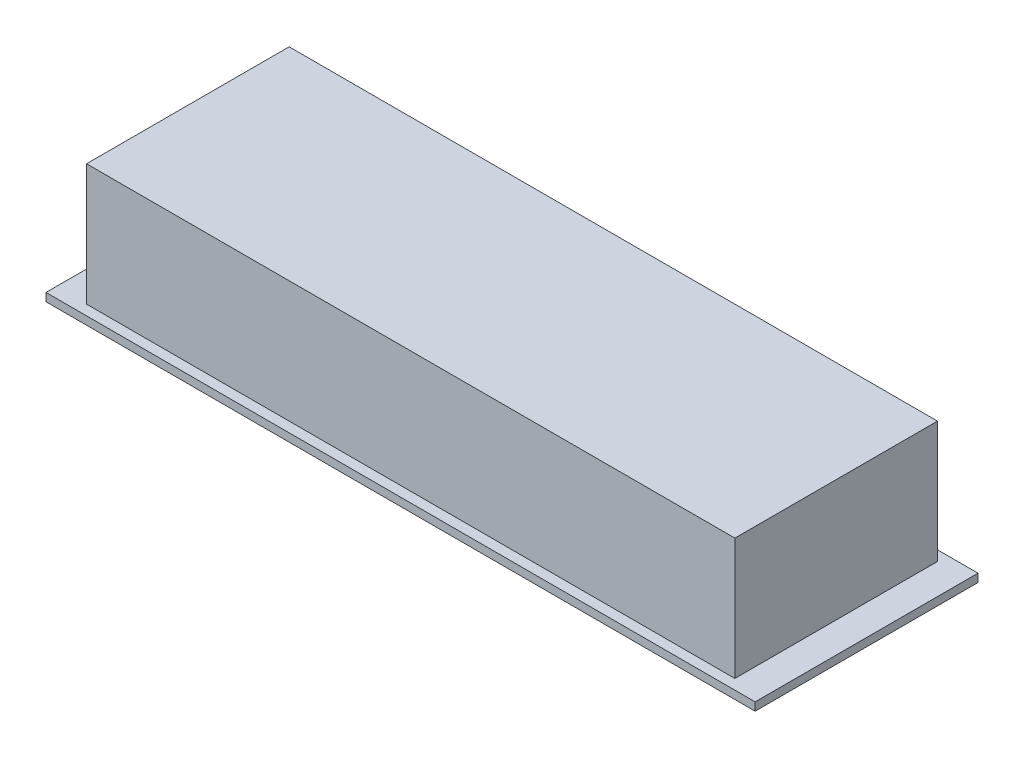
ISO-10303-21;
HEADER;
FILE_DESCRIPTION(('STEP AP214'),'2;1');
FILE_NAME('part.step','',(''),(''),'','','');
FILE_SCHEMA(('AUTOMOTIVE_DESIGN { 1 0 10303 214 1 1 1 1 }'));
ENDSEC;
DATA;
#1=APPLICATION_CONTEXT('core data for automotive mechanical design processes');
#2=APPLICATION_PROTOCOL_DEFINITION('international standard','automotive_design',2000,#1);
#3=PRODUCT_CONTEXT('',#1,'mechanical');
#4=PRODUCT('Part','Part','',(#3));
#5=PRODUCT_RELATED_PRODUCT_CATEGORY('part','',(#4));
#6=PRODUCT_DEFINITION_FORMATION('','',#4);
#7=PRODUCT_DEFINITION_CONTEXT('part definition',#1,'design');
#8=PRODUCT_DEFINITION('design','',#6,#7);
#9=PRODUCT_DEFINITION_SHAPE('','',#8);
#10=(LENGTH_UNIT() NAMED_UNIT(*) SI_UNIT(.MILLI.,.METRE.));
#11=(NAMED_UNIT(*) PLANE_ANGLE_UNIT() SI_UNIT($,.RADIAN.));
#12=(NAMED_UNIT(*) SI_UNIT($,.STERADIAN.) SOLID_ANGLE_UNIT());
#13=UNCERTAINTY_MEASURE_WITH_UNIT(LENGTH_MEASURE(1.E-05),#10,'distance_accuracy_value','');
#14=(GEOMETRIC_REPRESENTATION_CONTEXT(3) GLOBAL_UNCERTAINTY_ASSIGNED_CONTEXT((#13)) GLOBAL_UNIT_ASSIGNED_CONTEXT((#10,
#11,#12)) REPRESENTATION_CONTEXT('',''));
#15=CARTESIAN_POINT('',(0.,0.,0.));
#16=DIRECTION('',(0.,0.,1.));
#17=DIRECTION('',(1.,0.,0.));
#18=AXIS2_PLACEMENT_3D('',#15,#16,#17);
#19=CARTESIAN_POINT('',(101.6,38.1,-31.75));
#20=DIRECTION('',(-1.,0.,0.));
#21=DIRECTION('',(0.,0.,1.));
#22=AXIS2_PLACEMENT_3D('',#19,#20,#21);
#23=PLANE('',#22);
#24=DIRECTION('',(0.,0.,-1.));
#25=VECTOR('',#24,1.);
#26=CARTESIAN_POINT('',(101.6,0.,-31.75));
#27=LINE('',#26,#25);
#28=CARTESIAN_POINT('',(101.6,0.,31.75));
#29=VERTEX_POINT('',#28);
#30=CARTESIAN_POINT('',(101.6,0.,-31.75));
#31=VERTEX_POINT('',#30);
#32=EDGE_CURVE('E119',#29,#31,#27,.T.);
#33=ORIENTED_EDGE('',*,*,#32,.T.);
#34=DIRECTION('',(0.,-1.,0.));
#35=VECTOR('',#34,1.);
#36=CARTESIAN_POINT('',(101.6,38.1,-31.75));
#37=LINE('',#36,#35);
#38=CARTESIAN_POINT('',(101.6,38.1,-31.75));
#39=VERTEX_POINT('',#38);
#40=EDGE_CURVE('E11',#39,#31,#37,.T.);
#41=ORIENTED_EDGE('',*,*,#40,.F.);
#42=DIRECTION('',(0.,0.,-1.));
#43=VECTOR('',#42,1.);
#44=CARTESIAN_POINT('',(101.6,38.1,-31.75));
#45=LINE('',#44,#43);
#46=CARTESIAN_POINT('',(101.6,38.1,31.75));
#47=VERTEX_POINT('',#46);
#48=EDGE_CURVE('E128',#47,#39,#45,.T.);
#49=ORIENTED_EDGE('',*,*,#48,.F.);
#50=DIRECTION('',(0.,-1.,0.));
#51=VECTOR('',#50,1.);
#52=CARTESIAN_POINT('',(101.6,38.1,31.75));
#53=LINE('',#52,#51);
#54=EDGE_CURVE('E135',#47,#29,#53,.T.);
#55=ORIENTED_EDGE('',*,*,#54,.T.);
#56=EDGE_LOOP('',(#33,#41,#49,#55));
#57=FACE_BOUND('',#56,.T.);
#58=ADVANCED_FACE('F34',(#57),#23,.F.);
#59=CARTESIAN_POINT('',(-101.6,38.1,-31.75));
#60=DIRECTION('',(0.,0.,1.));
#61=DIRECTION('',(1.,0.,0.));
#62=AXIS2_PLACEMENT_3D('',#59,#60,#61);
#63=PLANE('',#62);
#64=DIRECTION('',(-1.,0.,0.));
#65=VECTOR('',#64,1.);
#66=CARTESIAN_POINT('',(-101.6,0.,-31.75));
#67=LINE('',#66,#65);
#68=CARTESIAN_POINT('',(-101.6,0.,-31.75));
#69=VERTEX_POINT('',#68);
#70=EDGE_CURVE('E122',#31,#69,#67,.T.);
#71=ORIENTED_EDGE('',*,*,#70,.T.);
#72=DIRECTION('',(0.,-1.,0.));
#73=VECTOR('',#72,1.);
#74=CARTESIAN_POINT('',(-101.6,38.1,-31.75));
#75=LINE('',#74,#73);
#76=CARTESIAN_POINT('',(-101.6,38.1,-31.75));
#77=VERTEX_POINT('',#76);
#78=EDGE_CURVE('E42',#77,#69,#75,.T.);
#79=ORIENTED_EDGE('',*,*,#78,.F.);
#80=DIRECTION('',(-1.,0.,0.));
#81=VECTOR('',#80,1.);
#82=CARTESIAN_POINT('',(-101.6,38.1,-31.75));
#83=LINE('',#82,#81);
#84=EDGE_CURVE('E130',#39,#77,#83,.T.);
#85=ORIENTED_EDGE('',*,*,#84,.F.);
#86=ORIENTED_EDGE('',*,*,#40,.T.);
#87=EDGE_LOOP('',(#71,#79,#85,#86));
#88=FACE_BOUND('',#87,.T.);
#89=ADVANCED_FACE('F156',(#88),#63,.F.);
#90=CARTESIAN_POINT('',(-101.6,38.1,-31.75));
#91=DIRECTION('',(1.,0.,0.));
#92=DIRECTION('',(0.,0.,-1.));
#93=AXIS2_PLACEMENT_3D('',#90,#91,#92);
#94=PLANE('',#93);
#95=DIRECTION('',(0.,0.,1.));
#96=VECTOR('',#95,1.);
#97=CARTESIAN_POINT('',(-101.6,0.,-31.75));
#98=LINE('',#97,#96);
#99=CARTESIAN_POINT('',(-101.6,0.,31.75));
#100=VERTEX_POINT('',#99);
#101=EDGE_CURVE('E139',#69,#100,#98,.T.);
#102=ORIENTED_EDGE('',*,*,#101,.T.);
#103=DIRECTION('',(0.,-1.,0.));
#104=VECTOR('',#103,1.);
#105=CARTESIAN_POINT('',(-101.6,38.1,31.75));
#106=LINE('',#105,#104);
#107=CARTESIAN_POINT('',(-101.6,38.1,31.75));
#108=VERTEX_POINT('',#107);
#109=EDGE_CURVE('E146',#108,#100,#106,.T.);
#110=ORIENTED_EDGE('',*,*,#109,.F.);
#111=DIRECTION('',(0.,0.,1.));
#112=VECTOR('',#111,1.);
#113=CARTESIAN_POINT('',(-101.6,38.1,-31.75));
#114=LINE('',#113,#112);
#115=EDGE_CURVE('E133',#77,#108,#114,.T.);
#116=ORIENTED_EDGE('',*,*,#115,.F.);
#117=ORIENTED_EDGE('',*,*,#78,.T.);
#118=EDGE_LOOP('',(#102,#110,#116,#117));
#119=FACE_BOUND('',#118,.T.);
#120=ADVANCED_FACE('F152',(#119),#94,.F.);
#121=CARTESIAN_POINT('',(-101.6,38.1,31.75));
#122=DIRECTION('',(0.,0.,-1.));
#123=DIRECTION('',(-1.,0.,0.));
#124=AXIS2_PLACEMENT_3D('',#121,#122,#123);
#125=PLANE('',#124);
#126=DIRECTION('',(1.,0.,0.));
#127=VECTOR('',#126,1.);
#128=CARTESIAN_POINT('',(-101.6,0.,31.75));
#129=LINE('',#128,#127);
#130=EDGE_CURVE('E131',#100,#29,#129,.T.);
#131=ORIENTED_EDGE('',*,*,#130,.T.);
#132=ORIENTED_EDGE('',*,*,#54,.F.);
#133=DIRECTION('',(1.,0.,0.));
#134=VECTOR('',#133,1.);
#135=CARTESIAN_POINT('',(-101.6,38.1,31.75));
#136=LINE('',#135,#134);
#137=EDGE_CURVE('E49',#108,#47,#136,.T.);
#138=ORIENTED_EDGE('',*,*,#137,.F.);
#139=ORIENTED_EDGE('',*,*,#109,.T.);
#140=EDGE_LOOP('',(#131,#132,#138,#139));
#141=FACE_BOUND('',#140,.T.);
#142=ADVANCED_FACE('F162',(#141),#125,.F.);
#143=CARTESIAN_POINT('',(0.,38.1,0.));
#144=DIRECTION('',(0.,1.,0.));
#145=DIRECTION('',(0.,0.,1.));
#146=AXIS2_PLACEMENT_3D('',#143,#144,#145);
#147=PLANE('',#146);
#148=ORIENTED_EDGE('',*,*,#48,.T.);
#149=ORIENTED_EDGE('',*,*,#84,.T.);
#150=ORIENTED_EDGE('',*,*,#115,.T.);
#151=ORIENTED_EDGE('',*,*,#137,.T.);
#152=EDGE_LOOP('',(#148,#149,#150,#151));
#153=FACE_BOUND('',#152,.T.);
#154=ADVANCED_FACE('F165',(#153),#147,.T.);
#155=CARTESIAN_POINT('',(111.125,-2.54,34.925));
#156=DIRECTION('',(-1.,0.,0.));
#157=DIRECTION('',(0.,0.,1.));
#158=AXIS2_PLACEMENT_3D('',#155,#156,#157);
#159=PLANE('',#158);
#160=DIRECTION('',(0.,0.,1.));
#161=VECTOR('',#160,1.);
#162=CARTESIAN_POINT('',(111.125,0.,34.925));
#163=LINE('',#162,#161);
#164=CARTESIAN_POINT('',(111.125,0.,-34.925));
#165=VERTEX_POINT('',#164);
#166=CARTESIAN_POINT('',(111.125,0.,34.925));
#167=VERTEX_POINT('',#166);
#168=EDGE_CURVE('E118',#165,#167,#163,.T.);
#169=ORIENTED_EDGE('',*,*,#168,.T.);
#170=DIRECTION('',(0.,1.,0.));
#171=VECTOR('',#170,1.);
#172=CARTESIAN_POINT('',(111.125,-2.54,34.925));
#173=LINE('',#172,#171);
#174=CARTESIAN_POINT('',(111.125,-2.54,34.925));
#175=VERTEX_POINT('',#174);
#176=EDGE_CURVE('E98',#175,#167,#173,.T.);
#177=ORIENTED_EDGE('',*,*,#176,.F.);
#178=DIRECTION('',(0.,0.,1.));
#179=VECTOR('',#178,1.);
#180=CARTESIAN_POINT('',(111.125,-2.54,34.925));
#181=LINE('',#180,#179);
#182=CARTESIAN_POINT('',(111.125,-2.54,-34.925));
#183=VERTEX_POINT('',#182);
#184=EDGE_CURVE('E105',#183,#175,#181,.T.);
#185=ORIENTED_EDGE('',*,*,#184,.F.);
#186=DIRECTION('',(0.,1.,0.));
#187=VECTOR('',#186,1.);
#188=CARTESIAN_POINT('',(111.125,-2.54,-34.925));
#189=LINE('',#188,#187);
#190=EDGE_CURVE('E245',#183,#165,#189,.T.);
#191=ORIENTED_EDGE('',*,*,#190,.T.);
#192=EDGE_LOOP('',(#169,#177,#185,#191));
#193=FACE_BOUND('',#192,.T.);
#194=ADVANCED_FACE('F116',(#193),#159,.F.);
#195=CARTESIAN_POINT('',(-111.125,-2.54,34.925));
#196=DIRECTION('',(0.,0.,-1.));
#197=DIRECTION('',(-1.,0.,0.));
#198=AXIS2_PLACEMENT_3D('',#195,#196,#197);
#199=PLANE('',#198);
#200=DIRECTION('',(-1.,0.,0.));
#201=VECTOR('',#200,1.);
#202=CARTESIAN_POINT('',(-111.125,0.,34.925));
#203=LINE('',#202,#201);
#204=CARTESIAN_POINT('',(-111.125,0.,34.925));
#205=VERTEX_POINT('',#204);
#206=EDGE_CURVE('E251',#167,#205,#203,.T.);
#207=ORIENTED_EDGE('',*,*,#206,.T.);
#208=DIRECTION('',(0.,1.,0.));
#209=VECTOR('',#208,1.);
#210=CARTESIAN_POINT('',(-111.125,-2.54,34.925));
#211=LINE('',#210,#209);
#212=CARTESIAN_POINT('',(-111.125,-2.54,34.925));
#213=VERTEX_POINT('',#212);
#214=EDGE_CURVE('E101',#213,#205,#211,.T.);
#215=ORIENTED_EDGE('',*,*,#214,.F.);
#216=DIRECTION('',(-1.,0.,0.));
#217=VECTOR('',#216,1.);
#218=CARTESIAN_POINT('',(-111.125,-2.54,34.925));
#219=LINE('',#218,#217);
#220=EDGE_CURVE('E94',#175,#213,#219,.T.);
#221=ORIENTED_EDGE('',*,*,#220,.F.);
#222=ORIENTED_EDGE('',*,*,#176,.T.);
#223=EDGE_LOOP('',(#207,#215,#221,#222));
#224=FACE_BOUND('',#223,.T.);
#225=ADVANCED_FACE('F96',(#224),#199,.F.);
#226=CARTESIAN_POINT('',(-111.125,-2.54,34.925));
#227=DIRECTION('',(1.,0.,0.));
#228=DIRECTION('',(0.,0.,-1.));
#229=AXIS2_PLACEMENT_3D('',#226,#227,#228);
#230=PLANE('',#229);
#231=DIRECTION('',(0.,0.,-1.));
#232=VECTOR('',#231,1.);
#233=CARTESIAN_POINT('',(-111.125,0.,34.925));
#234=LINE('',#233,#232);
#235=CARTESIAN_POINT('',(-111.125,0.,-34.925));
#236=VERTEX_POINT('',#235);
#237=EDGE_CURVE('E248',#205,#236,#234,.T.);
#238=ORIENTED_EDGE('',*,*,#237,.T.);
#239=DIRECTION('',(0.,1.,0.));
#240=VECTOR('',#239,1.);
#241=CARTESIAN_POINT('',(-111.125,-2.54,-34.925));
#242=LINE('',#241,#240);
#243=CARTESIAN_POINT('',(-111.125,-2.54,-34.925));
#244=VERTEX_POINT('',#243);
#245=EDGE_CURVE('E124',#244,#236,#242,.T.);
#246=ORIENTED_EDGE('',*,*,#245,.F.);
#247=DIRECTION('',(0.,0.,-1.));
#248=VECTOR('',#247,1.);
#249=CARTESIAN_POINT('',(-111.125,-2.54,34.925));
#250=LINE('',#249,#248);
#251=EDGE_CURVE('E104',#213,#244,#250,.T.);
#252=ORIENTED_EDGE('',*,*,#251,.F.);
#253=ORIENTED_EDGE('',*,*,#214,.T.);
#254=EDGE_LOOP('',(#238,#246,#252,#253));
#255=FACE_BOUND('',#254,.T.);
#256=ADVANCED_FACE('F204',(#255),#230,.F.);
#257=CARTESIAN_POINT('',(-111.125,-2.54,-34.925));
#258=DIRECTION('',(0.,0.,1.));
#259=DIRECTION('',(1.,0.,0.));
#260=AXIS2_PLACEMENT_3D('',#257,#258,#259);
#261=PLANE('',#260);
#262=DIRECTION('',(1.,0.,0.));
#263=VECTOR('',#262,1.);
#264=CARTESIAN_POINT('',(-111.125,0.,-34.925));
#265=LINE('',#264,#263);
#266=EDGE_CURVE('E114',#236,#165,#265,.T.);
#267=ORIENTED_EDGE('',*,*,#266,.T.);
#268=ORIENTED_EDGE('',*,*,#190,.F.);
#269=DIRECTION('',(1.,0.,0.));
#270=VECTOR('',#269,1.);
#271=CARTESIAN_POINT('',(-111.125,-2.54,-34.925));
#272=LINE('',#271,#270);
#273=EDGE_CURVE('E110',#244,#183,#272,.T.);
#274=ORIENTED_EDGE('',*,*,#273,.F.);
#275=ORIENTED_EDGE('',*,*,#245,.T.);
#276=EDGE_LOOP('',(#267,#268,#274,#275));
#277=FACE_BOUND('',#276,.T.);
#278=ADVANCED_FACE('F213',(#277),#261,.F.);
#279=CARTESIAN_POINT('',(0.,-2.54,0.));
#280=DIRECTION('',(0.,-1.,0.));
#281=DIRECTION('',(0.,0.,-1.));
#282=AXIS2_PLACEMENT_3D('',#279,#280,#281);
#283=PLANE('',#282);
#284=ORIENTED_EDGE('',*,*,#184,.T.);
#285=ORIENTED_EDGE('',*,*,#220,.T.);
#286=ORIENTED_EDGE('',*,*,#251,.T.);
#287=ORIENTED_EDGE('',*,*,#273,.T.);
#288=EDGE_LOOP('',(#284,#285,#286,#287));
#289=FACE_BOUND('',#288,.T.);
#290=ADVANCED_FACE('F108',(#289),#283,.T.);
#291=CARTESIAN_POINT('',(0.,0.,0.));
#292=DIRECTION('',(0.,-1.,0.));
#293=DIRECTION('',(0.,0.,-1.));
#294=AXIS2_PLACEMENT_3D('',#291,#292,#293);
#295=PLANE('',#294);
#296=ORIENTED_EDGE('',*,*,#32,.F.);
#297=ORIENTED_EDGE('',*,*,#130,.F.);
#298=ORIENTED_EDGE('',*,*,#101,.F.);
#299=ORIENTED_EDGE('',*,*,#70,.F.);
#300=EDGE_LOOP('',(#296,#297,#298,#299));
#301=FACE_BOUND('',#300,.T.);
#302=ORIENTED_EDGE('',*,*,#168,.F.);
#303=ORIENTED_EDGE('',*,*,#266,.F.);
#304=ORIENTED_EDGE('',*,*,#237,.F.);
#305=ORIENTED_EDGE('',*,*,#206,.F.);
#306=EDGE_LOOP('',(#302,#303,#304,#305));
#307=FACE_BOUND('',#306,.T.);
#308=ADVANCED_FACE('F159',(#301,#307),#295,.F.);
#309=CLOSED_SHELL('',(#58,#89,#120,#142,#154,#194,#225,#256,#278,#290,#308));
#310=MANIFOLD_SOLID_BREP('B2',#309);
#311=ADVANCED_BREP_SHAPE_REPRESENTATION('',(#18,#310),#14);
#312=SHAPE_DEFINITION_REPRESENTATION(#9,#311);
ENDSEC;
END-ISO-10303-21;
